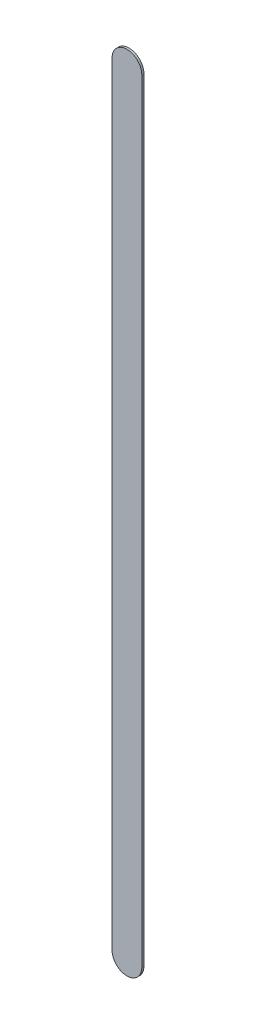
ISO-10303-21;
HEADER;
FILE_DESCRIPTION(('STEP AP214'),'2;1');
FILE_NAME('part.step','',(''),(''),'','','');
FILE_SCHEMA(('AUTOMOTIVE_DESIGN { 1 0 10303 214 1 1 1 1 }'));
ENDSEC;
DATA;
#1=APPLICATION_CONTEXT('core data for automotive mechanical design processes');
#2=APPLICATION_PROTOCOL_DEFINITION('international standard','automotive_design',2000,#1);
#3=PRODUCT_CONTEXT('',#1,'mechanical');
#4=PRODUCT('Part','Part','',(#3));
#5=PRODUCT_RELATED_PRODUCT_CATEGORY('part','',(#4));
#6=PRODUCT_DEFINITION_FORMATION('','',#4);
#7=PRODUCT_DEFINITION_CONTEXT('part definition',#1,'design');
#8=PRODUCT_DEFINITION('design','',#6,#7);
#9=PRODUCT_DEFINITION_SHAPE('','',#8);
#10=(LENGTH_UNIT() NAMED_UNIT(*) SI_UNIT(.MILLI.,.METRE.));
#11=(NAMED_UNIT(*) PLANE_ANGLE_UNIT() SI_UNIT($,.RADIAN.));
#12=(NAMED_UNIT(*) SI_UNIT($,.STERADIAN.) SOLID_ANGLE_UNIT());
#13=UNCERTAINTY_MEASURE_WITH_UNIT(LENGTH_MEASURE(1.E-05),#10,'distance_accuracy_value','');
#14=(GEOMETRIC_REPRESENTATION_CONTEXT(3) GLOBAL_UNCERTAINTY_ASSIGNED_CONTEXT((#13)) GLOBAL_UNIT_ASSIGNED_CONTEXT((#10,
#11,#12)) REPRESENTATION_CONTEXT('',''));
#15=CARTESIAN_POINT('',(0.,0.,0.));
#16=DIRECTION('',(0.,0.,1.));
#17=DIRECTION('',(1.,0.,0.));
#18=AXIS2_PLACEMENT_3D('',#15,#16,#17);
#19=CARTESIAN_POINT('',(99.89600036,77.25400094,0.));
#20=DIRECTION('',(-1.,0.,0.));
#21=DIRECTION('',(0.,1.,0.));
#22=AXIS2_PLACEMENT_3D('',#19,#20,#21);
#23=PLANE('',#22);
#24=DIRECTION('',(0.,1.,0.));
#25=VECTOR('',#24,1.);
#26=CARTESIAN_POINT('',(99.89600036,77.25400094,0.03556));
#27=LINE('',#26,#25);
#28=CARTESIAN_POINT('',(99.89600036,77.25400094,0.03556));
#29=VERTEX_POINT('',#28);
#30=CARTESIAN_POINT('',(99.89600036,90.25400034,0.03556));
#31=VERTEX_POINT('',#30);
#32=EDGE_CURVE('E11',#29,#31,#27,.T.);
#33=ORIENTED_EDGE('',*,*,#32,.F.);
#34=DIRECTION('',(0.,0.,1.));
#35=VECTOR('',#34,1.);
#36=CARTESIAN_POINT('',(99.89600036,77.25400094,0.));
#37=LINE('',#36,#35);
#38=CARTESIAN_POINT('',(99.89600036,77.25400094,0.));
#39=VERTEX_POINT('',#38);
#40=EDGE_CURVE('E24',#39,#29,#37,.T.);
#41=ORIENTED_EDGE('',*,*,#40,.F.);
#42=DIRECTION('',(0.,1.,0.));
#43=VECTOR('',#42,1.);
#44=CARTESIAN_POINT('',(99.89600036,77.25400094,0.));
#45=LINE('',#44,#43);
#46=CARTESIAN_POINT('',(99.89600036,90.25400034,0.));
#47=VERTEX_POINT('',#46);
#48=EDGE_CURVE('E75',#39,#47,#45,.T.);
#49=ORIENTED_EDGE('',*,*,#48,.T.);
#50=DIRECTION('',(0.,0.,1.));
#51=VECTOR('',#50,1.);
#52=CARTESIAN_POINT('',(99.89600036,90.25400034,0.));
#53=LINE('',#52,#51);
#54=EDGE_CURVE('E37',#47,#31,#53,.T.);
#55=ORIENTED_EDGE('',*,*,#54,.T.);
#56=EDGE_LOOP('',(#33,#41,#49,#55));
#57=FACE_BOUND('',#56,.T.);
#58=ADVANCED_FACE('F17',(#57),#23,.F.);
#59=CARTESIAN_POINT('',(99.64600086,90.25400034,0.));
#60=DIRECTION('',(0.,0.,-1.));
#61=DIRECTION('',(1.,0.,0.));
#62=AXIS2_PLACEMENT_3D('',#59,#60,#61);
#63=CYLINDRICAL_SURFACE('',#62,0.249999499999992);
#64=CARTESIAN_POINT('',(99.64600086,90.25400034,0.03556));
#65=DIRECTION('',(0.,0.,1.));
#66=DIRECTION('',(1.,0.,0.));
#67=AXIS2_PLACEMENT_3D('',#64,#65,#66);
#68=CIRCLE('',#67,0.249999499999992);
#69=CARTESIAN_POINT('',(99.39600136,90.25400034,0.03556));
#70=VERTEX_POINT('',#69);
#71=EDGE_CURVE('E83',#31,#70,#68,.T.);
#72=ORIENTED_EDGE('',*,*,#71,.F.);
#73=ORIENTED_EDGE('',*,*,#54,.F.);
#74=CARTESIAN_POINT('',(99.64600086,90.25400034,0.));
#75=DIRECTION('',(0.,0.,1.));
#76=DIRECTION('',(1.,0.,0.));
#77=AXIS2_PLACEMENT_3D('',#74,#75,#76);
#78=CIRCLE('',#77,0.249999499999992);
#79=CARTESIAN_POINT('',(99.39600136,90.25400034,0.));
#80=VERTEX_POINT('',#79);
#81=EDGE_CURVE('E81',#47,#80,#78,.T.);
#82=ORIENTED_EDGE('',*,*,#81,.T.);
#83=DIRECTION('',(0.,0.,1.));
#84=VECTOR('',#83,1.);
#85=CARTESIAN_POINT('',(99.39600136,90.25400034,0.));
#86=LINE('',#85,#84);
#87=EDGE_CURVE('E67',#80,#70,#86,.T.);
#88=ORIENTED_EDGE('',*,*,#87,.T.);
#89=EDGE_LOOP('',(#72,#73,#82,#88));
#90=FACE_BOUND('',#89,.T.);
#91=ADVANCED_FACE('F89',(#90),#63,.T.);
#92=CARTESIAN_POINT('',(99.39600136,90.25400034,0.));
#93=DIRECTION('',(1.,0.,0.));
#94=DIRECTION('',(0.,-1.,0.));
#95=AXIS2_PLACEMENT_3D('',#92,#93,#94);
#96=PLANE('',#95);
#97=DIRECTION('',(0.,-1.,0.));
#98=VECTOR('',#97,1.);
#99=CARTESIAN_POINT('',(99.39600136,90.25400034,0.03556));
#100=LINE('',#99,#98);
#101=CARTESIAN_POINT('',(99.39600136,77.25400094,0.03556));
#102=VERTEX_POINT('',#101);
#103=EDGE_CURVE('E71',#70,#102,#100,.T.);
#104=ORIENTED_EDGE('',*,*,#103,.F.);
#105=ORIENTED_EDGE('',*,*,#87,.F.);
#106=DIRECTION('',(0.,-1.,0.));
#107=VECTOR('',#106,1.);
#108=CARTESIAN_POINT('',(99.39600136,90.25400034,0.));
#109=LINE('',#108,#107);
#110=CARTESIAN_POINT('',(99.39600136,77.25400094,0.));
#111=VERTEX_POINT('',#110);
#112=EDGE_CURVE('E63',#80,#111,#109,.T.);
#113=ORIENTED_EDGE('',*,*,#112,.T.);
#114=DIRECTION('',(0.,0.,1.));
#115=VECTOR('',#114,1.);
#116=CARTESIAN_POINT('',(99.39600136,77.25400094,0.));
#117=LINE('',#116,#115);
#118=EDGE_CURVE('E53',#111,#102,#117,.T.);
#119=ORIENTED_EDGE('',*,*,#118,.T.);
#120=EDGE_LOOP('',(#104,#105,#113,#119));
#121=FACE_BOUND('',#120,.T.);
#122=ADVANCED_FACE('F66',(#121),#96,.F.);
#123=CARTESIAN_POINT('',(99.64600086,77.25400094,0.));
#124=DIRECTION('',(0.,0.,-1.));
#125=DIRECTION('',(-1.,0.,0.));
#126=AXIS2_PLACEMENT_3D('',#123,#124,#125);
#127=CYLINDRICAL_SURFACE('',#126,0.249999499999992);
#128=CARTESIAN_POINT('',(99.64600086,77.25400094,0.03556));
#129=DIRECTION('',(0.,0.,1.));
#130=DIRECTION('',(-1.,0.,0.));
#131=AXIS2_PLACEMENT_3D('',#128,#129,#130);
#132=CIRCLE('',#131,0.249999499999992);
#133=EDGE_CURVE('E59',#102,#29,#132,.T.);
#134=ORIENTED_EDGE('',*,*,#133,.F.);
#135=ORIENTED_EDGE('',*,*,#118,.F.);
#136=CARTESIAN_POINT('',(99.64600086,77.25400094,0.));
#137=DIRECTION('',(0.,0.,1.));
#138=DIRECTION('',(-1.,0.,0.));
#139=AXIS2_PLACEMENT_3D('',#136,#137,#138);
#140=CIRCLE('',#139,0.249999499999992);
#141=EDGE_CURVE('E57',#111,#39,#140,.T.);
#142=ORIENTED_EDGE('',*,*,#141,.T.);
#143=ORIENTED_EDGE('',*,*,#40,.T.);
#144=EDGE_LOOP('',(#134,#135,#142,#143));
#145=FACE_BOUND('',#144,.T.);
#146=ADVANCED_FACE('F55',(#145),#127,.T.);
#147=CARTESIAN_POINT('',(99.89600036,77.25400094,0.));
#148=DIRECTION('',(0.,0.,-1.));
#149=DIRECTION('',(-1.,0.,0.));
#150=AXIS2_PLACEMENT_3D('',#147,#148,#149);
#151=PLANE('',#150);
#152=ORIENTED_EDGE('',*,*,#141,.F.);
#153=ORIENTED_EDGE('',*,*,#112,.F.);
#154=ORIENTED_EDGE('',*,*,#81,.F.);
#155=ORIENTED_EDGE('',*,*,#48,.F.);
#156=EDGE_LOOP('',(#152,#153,#154,#155));
#157=FACE_BOUND('',#156,.T.);
#158=ADVANCED_FACE('F74',(#157),#151,.T.);
#159=CARTESIAN_POINT('',(99.89600036,77.25400094,0.03556));
#160=DIRECTION('',(0.,0.,-1.));
#161=DIRECTION('',(-1.,0.,0.));
#162=AXIS2_PLACEMENT_3D('',#159,#160,#161);
#163=PLANE('',#162);
#164=ORIENTED_EDGE('',*,*,#32,.T.);
#165=ORIENTED_EDGE('',*,*,#71,.T.);
#166=ORIENTED_EDGE('',*,*,#103,.T.);
#167=ORIENTED_EDGE('',*,*,#133,.T.);
#168=EDGE_LOOP('',(#164,#165,#166,#167));
#169=FACE_BOUND('',#168,.T.);
#170=ADVANCED_FACE('F91',(#169),#163,.F.);
#171=CLOSED_SHELL('',(#58,#91,#122,#146,#158,#170));
#172=MANIFOLD_SOLID_BREP('B1',#171);
#173=ADVANCED_BREP_SHAPE_REPRESENTATION('',(#18,#172),#14);
#174=SHAPE_DEFINITION_REPRESENTATION(#9,#173);
ENDSEC;
END-ISO-10303-21;
